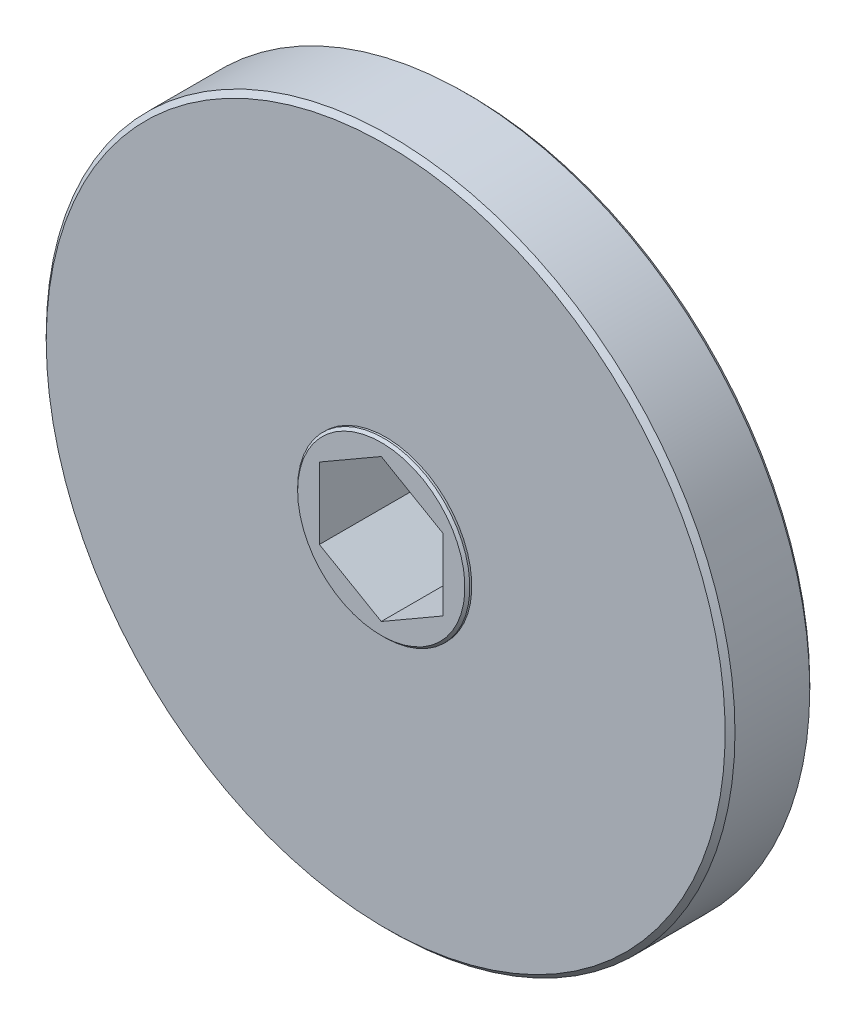
ISO-10303-21;
HEADER;
FILE_DESCRIPTION(('STEP AP214'),'2;1');
FILE_NAME('part.step','',(''),(''),'','','');
FILE_SCHEMA(('AUTOMOTIVE_DESIGN { 1 0 10303 214 1 1 1 1 }'));
ENDSEC;
DATA;
#1=APPLICATION_CONTEXT('core data for automotive mechanical design processes');
#2=APPLICATION_PROTOCOL_DEFINITION('international standard','automotive_design',2000,#1);
#3=PRODUCT_CONTEXT('',#1,'mechanical');
#4=PRODUCT('Part','Part','',(#3));
#5=PRODUCT_RELATED_PRODUCT_CATEGORY('part','',(#4));
#6=PRODUCT_DEFINITION_FORMATION('','',#4);
#7=PRODUCT_DEFINITION_CONTEXT('part definition',#1,'design');
#8=PRODUCT_DEFINITION('design','',#6,#7);
#9=PRODUCT_DEFINITION_SHAPE('','',#8);
#10=(LENGTH_UNIT() NAMED_UNIT(*) SI_UNIT(.MILLI.,.METRE.));
#11=(NAMED_UNIT(*) PLANE_ANGLE_UNIT() SI_UNIT($,.RADIAN.));
#12=(NAMED_UNIT(*) SI_UNIT($,.STERADIAN.) SOLID_ANGLE_UNIT());
#13=UNCERTAINTY_MEASURE_WITH_UNIT(LENGTH_MEASURE(1.E-05),#10,'distance_accuracy_value','');
#14=(GEOMETRIC_REPRESENTATION_CONTEXT(3) GLOBAL_UNCERTAINTY_ASSIGNED_CONTEXT((#13)) GLOBAL_UNIT_ASSIGNED_CONTEXT((#10,
#11,#12)) REPRESENTATION_CONTEXT('',''));
#15=CARTESIAN_POINT('',(0.,0.,0.));
#16=DIRECTION('',(0.,0.,1.));
#17=DIRECTION('',(1.,0.,0.));
#18=AXIS2_PLACEMENT_3D('',#15,#16,#17);
#19=CARTESIAN_POINT('',(0.,0.,9.398));
#20=DIRECTION('',(0.,0.,-1.));
#21=DIRECTION('',(-1.,0.,0.));
#22=AXIS2_PLACEMENT_3D('',#19,#20,#21);
#23=CONICAL_SURFACE('',#22,8.89,0.785398163397442);
#24=CARTESIAN_POINT('',(0.,0.,9.652));
#25=DIRECTION('',(0.,0.,-1.));
#26=DIRECTION('',(-1.,0.,0.));
#27=AXIS2_PLACEMENT_3D('',#24,#25,#26);
#28=CIRCLE('',#27,8.636);
#29=CARTESIAN_POINT('',(-8.636,0.,9.652));
#30=VERTEX_POINT('',#29);
#31=EDGE_CURVE('E19',#30,#30,#28,.T.);
#32=ORIENTED_EDGE('',*,*,#31,.T.);
#33=EDGE_LOOP('',(#32));
#34=FACE_BOUND('',#33,.T.);
#35=CARTESIAN_POINT('',(0.,0.,9.398));
#36=DIRECTION('',(0.,0.,-1.));
#37=DIRECTION('',(-1.,0.,0.));
#38=AXIS2_PLACEMENT_3D('',#35,#36,#37);
#39=CIRCLE('',#38,8.89);
#40=CARTESIAN_POINT('',(-8.89,0.,9.398));
#41=VERTEX_POINT('',#40);
#42=EDGE_CURVE('E96',#41,#41,#39,.T.);
#43=ORIENTED_EDGE('',*,*,#42,.F.);
#44=EDGE_LOOP('',(#43));
#45=FACE_BOUND('',#44,.T.);
#46=ADVANCED_FACE('F16',(#34,#45),#23,.T.);
#47=CARTESIAN_POINT('',(0.,0.,54.00675));
#48=DIRECTION('',(0.,0.,-1.));
#49=DIRECTION('',(-1.,0.,0.));
#50=AXIS2_PLACEMENT_3D('',#47,#48,#49);
#51=CYLINDRICAL_SURFACE('',#50,8.89);
#52=CARTESIAN_POINT('',(0.,0.,9.1948));
#53=DIRECTION('',(0.,0.,-1.));
#54=DIRECTION('',(-1.,0.,0.));
#55=AXIS2_PLACEMENT_3D('',#52,#53,#54);
#56=CIRCLE('',#55,8.89);
#57=CARTESIAN_POINT('',(-8.89,0.,9.1948));
#58=VERTEX_POINT('',#57);
#59=EDGE_CURVE('E80',#58,#58,#56,.T.);
#60=ORIENTED_EDGE('',*,*,#59,.F.);
#61=EDGE_LOOP('',(#60));
#62=FACE_BOUND('',#61,.T.);
#63=ORIENTED_EDGE('',*,*,#42,.T.);
#64=EDGE_LOOP('',(#63));
#65=FACE_BOUND('',#64,.T.);
#66=ADVANCED_FACE('F121',(#62,#65),#51,.T.);
#67=CARTESIAN_POINT('',(0.,0.,9.652));
#68=DIRECTION('',(0.,0.,-1.));
#69=DIRECTION('',(-1.,0.,0.));
#70=AXIS2_PLACEMENT_3D('',#67,#68,#69);
#71=PLANE('',#70);
#72=DIRECTION('',(0.,1.,0.));
#73=VECTOR('',#72,1.);
#74=CARTESIAN_POINT('',(-6.38810000000001,-3.68817125461025,9.65199999999999));
#75=LINE('',#74,#73);
#76=CARTESIAN_POINT('',(-6.38810000000001,3.68817125461025,9.65200000000002));
#77=VERTEX_POINT('',#76);
#78=CARTESIAN_POINT('',(-6.38810000000001,-3.68817125461025,9.652));
#79=VERTEX_POINT('',#78);
#80=EDGE_CURVE('E71',#77,#79,#75,.F.);
#81=ORIENTED_EDGE('',*,*,#80,.F.);
#82=DIRECTION('',(0.866025403784439,0.5,0.));
#83=VECTOR('',#82,1.);
#84=CARTESIAN_POINT('',(-6.38810000000001,3.68817125461025,9.65200000000005));
#85=LINE('',#84,#83);
#86=CARTESIAN_POINT('',(0.,7.3763425092205,9.65200000000001));
#87=VERTEX_POINT('',#86);
#88=EDGE_CURVE('E272',#87,#77,#85,.F.);
#89=ORIENTED_EDGE('',*,*,#88,.F.);
#90=DIRECTION('',(0.866025403784438,-0.500000000000001,0.));
#91=VECTOR('',#90,1.);
#92=CARTESIAN_POINT('',(0.,7.3763425092205,9.65199999999999));
#93=LINE('',#92,#91);
#94=CARTESIAN_POINT('',(6.38809999999999,3.68817125461025,9.652));
#95=VERTEX_POINT('',#94);
#96=EDGE_CURVE('E275',#95,#87,#93,.F.);
#97=ORIENTED_EDGE('',*,*,#96,.F.);
#98=DIRECTION('',(0.,1.,0.));
#99=VECTOR('',#98,1.);
#100=CARTESIAN_POINT('',(6.38809999999999,3.68817125461025,9.65199999999999));
#101=LINE('',#100,#99);
#102=CARTESIAN_POINT('',(6.38809999999999,-3.68817125461025,9.652));
#103=VERTEX_POINT('',#102);
#104=EDGE_CURVE('E256',#103,#95,#101,.T.);
#105=ORIENTED_EDGE('',*,*,#104,.F.);
#106=DIRECTION('',(-0.866025403784438,-0.5,0.));
#107=VECTOR('',#106,1.);
#108=CARTESIAN_POINT('',(6.38809999999999,-3.68817125461025,9.65199999999999));
#109=LINE('',#108,#107);
#110=CARTESIAN_POINT('',(0.,-7.3763425092205,9.652));
#111=VERTEX_POINT('',#110);
#112=EDGE_CURVE('E85',#111,#103,#109,.F.);
#113=ORIENTED_EDGE('',*,*,#112,.F.);
#114=DIRECTION('',(-0.866025403784438,0.5,0.));
#115=VECTOR('',#114,1.);
#116=CARTESIAN_POINT('',(0.,-7.3763425092205,9.65199999999999));
#117=LINE('',#116,#115);
#118=EDGE_CURVE('E66',#79,#111,#117,.F.);
#119=ORIENTED_EDGE('',*,*,#118,.F.);
#120=EDGE_LOOP('',(#81,#89,#97,#105,#113,#119));
#121=FACE_BOUND('',#120,.T.);
#122=ORIENTED_EDGE('',*,*,#31,.F.);
#123=EDGE_LOOP('',(#122));
#124=FACE_BOUND('',#123,.T.);
#125=ADVANCED_FACE('F82',(#121,#124),#71,.F.);
#126=CARTESIAN_POINT('',(8.89,0.,9.1948));
#127=DIRECTION('',(0.,0.,1.));
#128=DIRECTION('',(1.,0.,0.));
#129=AXIS2_PLACEMENT_3D('',#126,#127,#128);
#130=PLANE('',#129);
#131=ORIENTED_EDGE('',*,*,#59,.T.);
#132=EDGE_LOOP('',(#131));
#133=FACE_BOUND('',#132,.T.);
#134=CARTESIAN_POINT('',(0.,0.,9.19480000000001));
#135=DIRECTION('',(0.,0.,-1.));
#136=DIRECTION('',(-1.,0.,0.));
#137=AXIS2_PLACEMENT_3D('',#134,#135,#136);
#138=CIRCLE('',#137,35.052);
#139=CARTESIAN_POINT('',(-35.052,0.,9.19480000000001));
#140=VERTEX_POINT('',#139);
#141=EDGE_CURVE('E109',#140,#140,#138,.T.);
#142=ORIENTED_EDGE('',*,*,#141,.F.);
#143=EDGE_LOOP('',(#142));
#144=FACE_BOUND('',#143,.T.);
#145=ADVANCED_FACE('F120',(#133,#144),#130,.T.);
#146=CARTESIAN_POINT('',(-6.38810000000001,-3.68817125461025,-91.3889318246818));
#147=DIRECTION('',(1.,0.,0.));
#148=DIRECTION('',(0.,0.,-1.));
#149=AXIS2_PLACEMENT_3D('',#146,#147,#148);
#150=PLANE('',#149);
#151=DIRECTION('',(0.,0.,1.));
#152=VECTOR('',#151,1.);
#153=CARTESIAN_POINT('',(-6.38810000000001,-3.68817125461024,-91.3889318246818));
#154=LINE('',#153,#152);
#155=CARTESIAN_POINT('',(-6.38810000000001,-3.68817125461025,0.));
#156=VERTEX_POINT('',#155);
#157=EDGE_CURVE('E73',#156,#79,#154,.T.);
#158=ORIENTED_EDGE('',*,*,#157,.F.);
#159=DIRECTION('',(0.,1.,0.));
#160=VECTOR('',#159,1.);
#161=CARTESIAN_POINT('',(-6.38810000000001,0.,0.));
#162=LINE('',#161,#160);
#163=CARTESIAN_POINT('',(-6.38810000000001,3.68817125461025,0.));
#164=VERTEX_POINT('',#163);
#165=EDGE_CURVE('E111',#164,#156,#162,.F.);
#166=ORIENTED_EDGE('',*,*,#165,.F.);
#167=DIRECTION('',(0.,0.,1.));
#168=VECTOR('',#167,1.);
#169=CARTESIAN_POINT('',(-6.38810000000001,3.68817125461025,-91.3889318246818));
#170=LINE('',#169,#168);
#171=EDGE_CURVE('E76',#77,#164,#170,.F.);
#172=ORIENTED_EDGE('',*,*,#171,.F.);
#173=ORIENTED_EDGE('',*,*,#80,.T.);
#174=EDGE_LOOP('',(#158,#166,#172,#173));
#175=FACE_BOUND('',#174,.T.);
#176=ADVANCED_FACE('F72',(#175),#150,.T.);
#177=CARTESIAN_POINT('',(0.,-7.3763425092205,-91.3889318246818));
#178=DIRECTION('',(0.5,0.866025403784438,0.));
#179=DIRECTION('',(-0.866025403784438,0.5,0.));
#180=AXIS2_PLACEMENT_3D('',#177,#178,#179);
#181=PLANE('',#180);
#182=DIRECTION('',(0.,0.,1.));
#183=VECTOR('',#182,1.);
#184=CARTESIAN_POINT('',(0.,-7.3763425092205,-91.3889318246818));
#185=LINE('',#184,#183);
#186=CARTESIAN_POINT('',(0.,-7.3763425092205,0.));
#187=VERTEX_POINT('',#186);
#188=EDGE_CURVE('E87',#187,#111,#185,.T.);
#189=ORIENTED_EDGE('',*,*,#188,.F.);
#190=DIRECTION('',(0.866025403784439,-0.5,0.));
#191=VECTOR('',#190,1.);
#192=CARTESIAN_POINT('',(-6.38810000000001,-3.68817125461025,0.));
#193=LINE('',#192,#191);
#194=EDGE_CURVE('E91',#156,#187,#193,.T.);
#195=ORIENTED_EDGE('',*,*,#194,.F.);
#196=ORIENTED_EDGE('',*,*,#157,.T.);
#197=ORIENTED_EDGE('',*,*,#118,.T.);
#198=EDGE_LOOP('',(#189,#195,#196,#197));
#199=FACE_BOUND('',#198,.T.);
#200=ADVANCED_FACE('F89',(#199),#181,.T.);
#201=CARTESIAN_POINT('',(6.38809999999999,-3.68817125461025,-91.3889318246818));
#202=DIRECTION('',(-0.5,0.866025403784438,0.));
#203=DIRECTION('',(-0.866025403784438,-0.5,0.));
#204=AXIS2_PLACEMENT_3D('',#201,#202,#203);
#205=PLANE('',#204);
#206=DIRECTION('',(0.,0.,1.));
#207=VECTOR('',#206,1.);
#208=CARTESIAN_POINT('',(6.38809999999999,-3.68817125461025,-91.3889318246818));
#209=LINE('',#208,#207);
#210=CARTESIAN_POINT('',(6.38809999999999,-3.68817125461025,0.));
#211=VERTEX_POINT('',#210);
#212=EDGE_CURVE('E252',#211,#103,#209,.T.);
#213=ORIENTED_EDGE('',*,*,#212,.F.);
#214=DIRECTION('',(0.866025403784438,0.500000000000001,0.));
#215=VECTOR('',#214,1.);
#216=CARTESIAN_POINT('',(0.,-7.3763425092205,0.));
#217=LINE('',#216,#215);
#218=EDGE_CURVE('E255',#187,#211,#217,.T.);
#219=ORIENTED_EDGE('',*,*,#218,.F.);
#220=ORIENTED_EDGE('',*,*,#188,.T.);
#221=ORIENTED_EDGE('',*,*,#112,.T.);
#222=EDGE_LOOP('',(#213,#219,#220,#221));
#223=FACE_BOUND('',#222,.T.);
#224=ADVANCED_FACE('F172',(#223),#205,.T.);
#225=CARTESIAN_POINT('',(6.38809999999999,3.68817125461025,-91.3889318246818));
#226=DIRECTION('',(-1.,0.,0.));
#227=DIRECTION('',(0.,0.,1.));
#228=AXIS2_PLACEMENT_3D('',#225,#226,#227);
#229=PLANE('',#228);
#230=DIRECTION('',(0.,0.,1.));
#231=VECTOR('',#230,1.);
#232=CARTESIAN_POINT('',(6.38809999999999,3.68817125461025,-91.3889318246818));
#233=LINE('',#232,#231);
#234=CARTESIAN_POINT('',(6.38809999999999,3.68817125461025,0.));
#235=VERTEX_POINT('',#234);
#236=EDGE_CURVE('E261',#235,#95,#233,.T.);
#237=ORIENTED_EDGE('',*,*,#236,.F.);
#238=DIRECTION('',(0.,1.,0.));
#239=VECTOR('',#238,1.);
#240=CARTESIAN_POINT('',(6.38809999999999,0.,0.));
#241=LINE('',#240,#239);
#242=EDGE_CURVE('E259',#211,#235,#241,.T.);
#243=ORIENTED_EDGE('',*,*,#242,.F.);
#244=ORIENTED_EDGE('',*,*,#212,.T.);
#245=ORIENTED_EDGE('',*,*,#104,.T.);
#246=EDGE_LOOP('',(#237,#243,#244,#245));
#247=FACE_BOUND('',#246,.T.);
#248=ADVANCED_FACE('F169',(#247),#229,.T.);
#249=CARTESIAN_POINT('',(0.,7.3763425092205,-91.3889318246818));
#250=DIRECTION('',(-0.500000000000001,-0.866025403784438,0.));
#251=DIRECTION('',(0.866025403784438,-0.500000000000001,0.));
#252=AXIS2_PLACEMENT_3D('',#249,#250,#251);
#253=PLANE('',#252);
#254=DIRECTION('',(0.,0.,1.));
#255=VECTOR('',#254,1.);
#256=CARTESIAN_POINT('',(0.,7.3763425092205,-91.3889318246818));
#257=LINE('',#256,#255);
#258=CARTESIAN_POINT('',(0.,7.3763425092205,0.));
#259=VERTEX_POINT('',#258);
#260=EDGE_CURVE('E34',#259,#87,#257,.T.);
#261=ORIENTED_EDGE('',*,*,#260,.F.);
#262=DIRECTION('',(-0.866025403784438,0.500000000000001,0.));
#263=VECTOR('',#262,1.);
#264=CARTESIAN_POINT('',(6.38809999999999,3.68817125461025,0.));
#265=LINE('',#264,#263);
#266=EDGE_CURVE('E263',#235,#259,#265,.T.);
#267=ORIENTED_EDGE('',*,*,#266,.F.);
#268=ORIENTED_EDGE('',*,*,#236,.T.);
#269=ORIENTED_EDGE('',*,*,#96,.T.);
#270=EDGE_LOOP('',(#261,#267,#268,#269));
#271=FACE_BOUND('',#270,.T.);
#272=ADVANCED_FACE('F165',(#271),#253,.T.);
#273=CARTESIAN_POINT('',(-6.38810000000001,3.68817125461025,-91.3889318246818));
#274=DIRECTION('',(0.5,-0.866025403784439,0.));
#275=DIRECTION('',(0.866025403784439,0.5,0.));
#276=AXIS2_PLACEMENT_3D('',#273,#274,#275);
#277=PLANE('',#276);
#278=ORIENTED_EDGE('',*,*,#171,.T.);
#279=DIRECTION('',(-0.866025403784439,-0.5,0.));
#280=VECTOR('',#279,1.);
#281=CARTESIAN_POINT('',(0.,7.3763425092205,0.));
#282=LINE('',#281,#280);
#283=EDGE_CURVE('E281',#259,#164,#282,.T.);
#284=ORIENTED_EDGE('',*,*,#283,.F.);
#285=ORIENTED_EDGE('',*,*,#260,.T.);
#286=ORIENTED_EDGE('',*,*,#88,.T.);
#287=EDGE_LOOP('',(#278,#284,#285,#286));
#288=FACE_BOUND('',#287,.T.);
#289=ADVANCED_FACE('F161',(#288),#277,.T.);
#290=CARTESIAN_POINT('',(0.,0.,8.68680000000001));
#291=DIRECTION('',(0.,0.,-1.));
#292=DIRECTION('',(-1.,0.,0.));
#293=AXIS2_PLACEMENT_3D('',#290,#291,#292);
#294=CONICAL_SURFACE('',#293,35.56,0.78539816339745);
#295=CARTESIAN_POINT('',(0.,0.,8.68680000000001));
#296=DIRECTION('',(0.,0.,1.));
#297=DIRECTION('',(1.,0.,0.));
#298=AXIS2_PLACEMENT_3D('',#295,#296,#297);
#299=CIRCLE('',#298,35.56);
#300=CARTESIAN_POINT('',(35.56,0.,8.68680000000001));
#301=VERTEX_POINT('',#300);
#302=EDGE_CURVE('E108',#301,#301,#299,.F.);
#303=ORIENTED_EDGE('',*,*,#302,.F.);
#304=EDGE_LOOP('',(#303));
#305=FACE_BOUND('',#304,.T.);
#306=ORIENTED_EDGE('',*,*,#141,.T.);
#307=EDGE_LOOP('',(#306));
#308=FACE_BOUND('',#307,.T.);
#309=ADVANCED_FACE('F157',(#305,#308),#294,.T.);
#310=CARTESIAN_POINT('',(0.,0.,0.));
#311=DIRECTION('',(0.,0.,-1.));
#312=DIRECTION('',(-1.,0.,0.));
#313=AXIS2_PLACEMENT_3D('',#310,#311,#312);
#314=PLANE('',#313);
#315=ORIENTED_EDGE('',*,*,#266,.T.);
#316=ORIENTED_EDGE('',*,*,#283,.T.);
#317=ORIENTED_EDGE('',*,*,#165,.T.);
#318=ORIENTED_EDGE('',*,*,#194,.T.);
#319=ORIENTED_EDGE('',*,*,#218,.T.);
#320=ORIENTED_EDGE('',*,*,#242,.T.);
#321=EDGE_LOOP('',(#315,#316,#317,#318,#319,#320));
#322=FACE_BOUND('',#321,.T.);
#323=CARTESIAN_POINT('',(0.,0.,0.));
#324=DIRECTION('',(0.,0.,1.));
#325=DIRECTION('',(1.,0.,0.));
#326=AXIS2_PLACEMENT_3D('',#323,#324,#325);
#327=CIRCLE('',#326,8.636);
#328=CARTESIAN_POINT('',(8.636,0.,0.));
#329=VERTEX_POINT('',#328);
#330=EDGE_CURVE('E104',#329,#329,#327,.T.);
#331=ORIENTED_EDGE('',*,*,#330,.F.);
#332=EDGE_LOOP('',(#331));
#333=FACE_BOUND('',#332,.T.);
#334=ADVANCED_FACE('F153',(#322,#333),#314,.T.);
#335=CARTESIAN_POINT('',(0.,0.,9.652));
#336=DIRECTION('',(0.,0.,1.));
#337=DIRECTION('',(1.,0.,0.));
#338=AXIS2_PLACEMENT_3D('',#335,#336,#337);
#339=CYLINDRICAL_SURFACE('',#338,35.56);
#340=ORIENTED_EDGE('',*,*,#302,.T.);
#341=EDGE_LOOP('',(#340));
#342=FACE_BOUND('',#341,.T.);
#343=CARTESIAN_POINT('',(0.,0.,0.965199999999999));
#344=DIRECTION('',(0.,0.,1.));
#345=DIRECTION('',(1.,0.,0.));
#346=AXIS2_PLACEMENT_3D('',#343,#344,#345);
#347=CIRCLE('',#346,35.56);
#348=CARTESIAN_POINT('',(35.56,0.,0.9652));
#349=VERTEX_POINT('',#348);
#350=EDGE_CURVE('E107',#349,#349,#347,.F.);
#351=ORIENTED_EDGE('',*,*,#350,.F.);
#352=EDGE_LOOP('',(#351));
#353=FACE_BOUND('',#352,.T.);
#354=ADVANCED_FACE('F149',(#342,#353),#339,.T.);
#355=CARTESIAN_POINT('',(0.,0.,0.253999999999997));
#356=DIRECTION('',(0.,0.,1.));
#357=DIRECTION('',(1.,0.,0.));
#358=AXIS2_PLACEMENT_3D('',#355,#356,#357);
#359=CONICAL_SURFACE('',#358,8.89,0.785398163397455);
#360=CARTESIAN_POINT('',(0.,0.,0.253999999999997));
#361=DIRECTION('',(0.,0.,-1.));
#362=DIRECTION('',(-1.,0.,0.));
#363=AXIS2_PLACEMENT_3D('',#360,#361,#362);
#364=CIRCLE('',#363,8.89);
#365=CARTESIAN_POINT('',(-8.89,0.,0.253999999999997));
#366=VERTEX_POINT('',#365);
#367=EDGE_CURVE('E103',#366,#366,#364,.F.);
#368=ORIENTED_EDGE('',*,*,#367,.F.);
#369=EDGE_LOOP('',(#368));
#370=FACE_BOUND('',#369,.T.);
#371=ORIENTED_EDGE('',*,*,#330,.T.);
#372=EDGE_LOOP('',(#371));
#373=FACE_BOUND('',#372,.T.);
#374=ADVANCED_FACE('F145',(#370,#373),#359,.T.);
#375=CARTESIAN_POINT('',(0.,0.,0.965199999999999));
#376=DIRECTION('',(0.,0.,1.));
#377=DIRECTION('',(1.,0.,0.));
#378=AXIS2_PLACEMENT_3D('',#375,#376,#377);
#379=CONICAL_SURFACE('',#378,35.56,0.785398163397448);
#380=ORIENTED_EDGE('',*,*,#350,.T.);
#381=EDGE_LOOP('',(#380));
#382=FACE_BOUND('',#381,.T.);
#383=CARTESIAN_POINT('',(0.,0.,0.457200000000001));
#384=DIRECTION('',(0.,0.,1.));
#385=DIRECTION('',(1.,0.,0.));
#386=AXIS2_PLACEMENT_3D('',#383,#384,#385);
#387=CIRCLE('',#386,35.052);
#388=CARTESIAN_POINT('',(35.052,0.,0.457200000000001));
#389=VERTEX_POINT('',#388);
#390=EDGE_CURVE('E25',#389,#389,#387,.F.);
#391=ORIENTED_EDGE('',*,*,#390,.F.);
#392=EDGE_LOOP('',(#391));
#393=FACE_BOUND('',#392,.T.);
#394=ADVANCED_FACE('F138',(#382,#393),#379,.T.);
#395=CARTESIAN_POINT('',(0.,0.,54.00675));
#396=DIRECTION('',(0.,0.,-1.));
#397=DIRECTION('',(-1.,0.,0.));
#398=AXIS2_PLACEMENT_3D('',#395,#396,#397);
#399=CYLINDRICAL_SURFACE('',#398,8.89);
#400=CARTESIAN_POINT('',(0.,0.,0.457199999999998));
#401=DIRECTION('',(0.,0.,-1.));
#402=DIRECTION('',(-1.,0.,0.));
#403=AXIS2_PLACEMENT_3D('',#400,#401,#402);
#404=CIRCLE('',#403,8.89);
#405=CARTESIAN_POINT('',(-8.89,0.,0.457199999999998));
#406=VERTEX_POINT('',#405);
#407=EDGE_CURVE('E11',#406,#406,#404,.F.);
#408=ORIENTED_EDGE('',*,*,#407,.F.);
#409=EDGE_LOOP('',(#408));
#410=FACE_BOUND('',#409,.T.);
#411=ORIENTED_EDGE('',*,*,#367,.T.);
#412=EDGE_LOOP('',(#411));
#413=FACE_BOUND('',#412,.T.);
#414=ADVANCED_FACE('F132',(#410,#413),#399,.T.);
#415=CARTESIAN_POINT('',(52.9260475831485,0.,0.457199999999997));
#416=DIRECTION('',(0.,0.,-1.));
#417=DIRECTION('',(-1.,0.,0.));
#418=AXIS2_PLACEMENT_3D('',#415,#416,#417);
#419=PLANE('',#418);
#420=ORIENTED_EDGE('',*,*,#407,.T.);
#421=EDGE_LOOP('',(#420));
#422=FACE_BOUND('',#421,.T.);
#423=ORIENTED_EDGE('',*,*,#390,.T.);
#424=EDGE_LOOP('',(#423));
#425=FACE_BOUND('',#424,.T.);
#426=ADVANCED_FACE('F130',(#422,#425),#419,.T.);
#427=CLOSED_SHELL('',(#46,#66,#125,#145,#176,#200,#224,#248,#272,#289,#309,#334,#354,#374,#394,
#414,#426));
#428=MANIFOLD_SOLID_BREP('B1',#427);
#429=ADVANCED_BREP_SHAPE_REPRESENTATION('',(#18,#428),#14);
#430=SHAPE_DEFINITION_REPRESENTATION(#9,#429);
ENDSEC;
END-ISO-10303-21;
